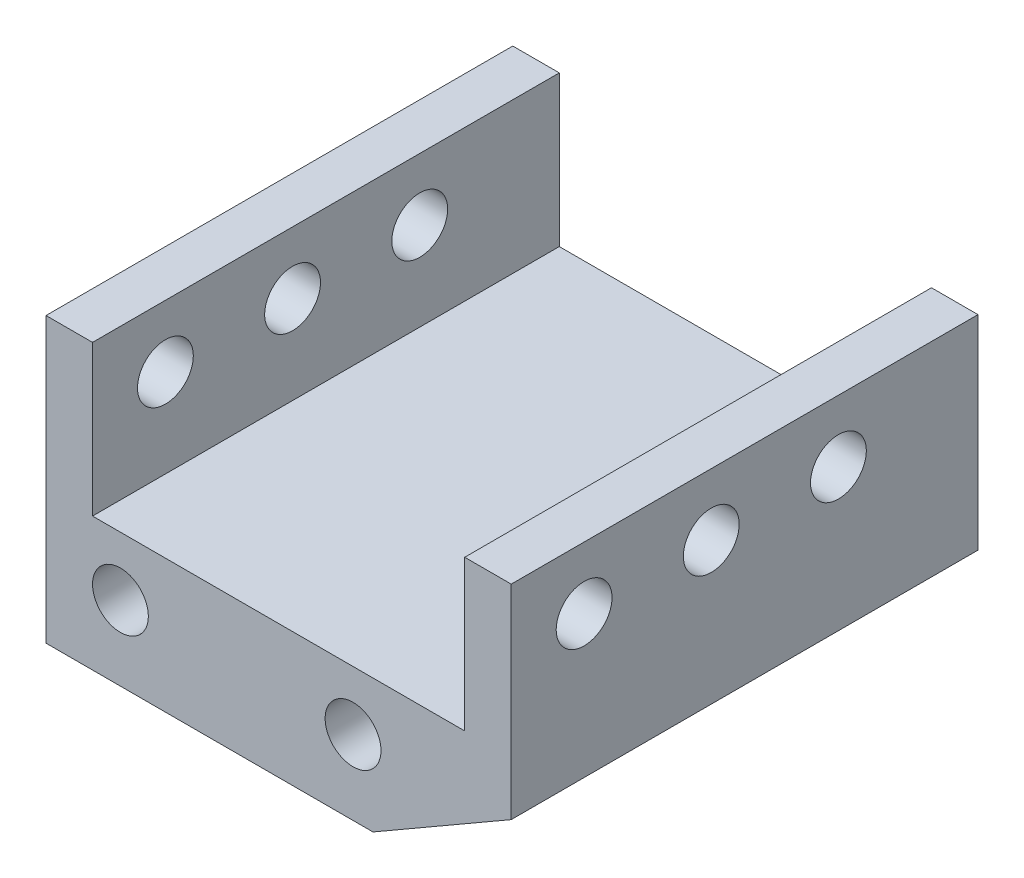
ISO-10303-21;
HEADER;
FILE_DESCRIPTION(('STEP AP214'),'2;1');
FILE_NAME('part.step','',(''),(''),'','','');
FILE_SCHEMA(('AUTOMOTIVE_DESIGN { 1 0 10303 214 1 1 1 1 }'));
ENDSEC;
DATA;
#1=APPLICATION_CONTEXT('core data for automotive mechanical design processes');
#2=APPLICATION_PROTOCOL_DEFINITION('international standard','automotive_design',2000,#1);
#3=PRODUCT_CONTEXT('',#1,'mechanical');
#4=PRODUCT('Part','Part','',(#3));
#5=PRODUCT_RELATED_PRODUCT_CATEGORY('part','',(#4));
#6=PRODUCT_DEFINITION_FORMATION('','',#4);
#7=PRODUCT_DEFINITION_CONTEXT('part definition',#1,'design');
#8=PRODUCT_DEFINITION('design','',#6,#7);
#9=PRODUCT_DEFINITION_SHAPE('','',#8);
#10=(LENGTH_UNIT() NAMED_UNIT(*) SI_UNIT(.MILLI.,.METRE.));
#11=(NAMED_UNIT(*) PLANE_ANGLE_UNIT() SI_UNIT($,.RADIAN.));
#12=(NAMED_UNIT(*) SI_UNIT($,.STERADIAN.) SOLID_ANGLE_UNIT());
#13=UNCERTAINTY_MEASURE_WITH_UNIT(LENGTH_MEASURE(1.E-05),#10,'distance_accuracy_value','');
#14=(GEOMETRIC_REPRESENTATION_CONTEXT(3) GLOBAL_UNCERTAINTY_ASSIGNED_CONTEXT((#13)) GLOBAL_UNIT_ASSIGNED_CONTEXT((#10,
#11,#12)) REPRESENTATION_CONTEXT('',''));
#15=CARTESIAN_POINT('',(0.,0.,0.));
#16=DIRECTION('',(0.,0.,1.));
#17=DIRECTION('',(1.,0.,0.));
#18=AXIS2_PLACEMENT_3D('',#15,#16,#17);
#19=CARTESIAN_POINT('',(-27.,8.69999999999999,-60.9410016931789));
#20=DIRECTION('',(-1.,0.,0.));
#21=DIRECTION('',(0.,-1.,0.));
#22=AXIS2_PLACEMENT_3D('',#19,#20,#21);
#23=PLANE('',#22);
#24=CARTESIAN_POINT('',(-27.,4.69999999999999,-21.1));
#25=DIRECTION('',(-1.,0.,0.));
#26=DIRECTION('',(0.,-1.,0.));
#27=AXIS2_PLACEMENT_3D('',#24,#25,#26);
#28=CIRCLE('',#27,1.8);
#29=CARTESIAN_POINT('',(-27.,2.89999999999999,-21.1));
#30=VERTEX_POINT('',#29);
#31=EDGE_CURVE('E154',#30,#30,#28,.T.);
#32=ORIENTED_EDGE('',*,*,#31,.F.);
#33=EDGE_LOOP('',(#32));
#34=FACE_BOUND('',#33,.T.);
#35=CARTESIAN_POINT('',(-27.,4.69999999999999,-12.9));
#36=DIRECTION('',(-1.,0.,0.));
#37=DIRECTION('',(0.,-1.,0.));
#38=AXIS2_PLACEMENT_3D('',#35,#36,#37);
#39=CIRCLE('',#38,1.8);
#40=CARTESIAN_POINT('',(-27.,2.9,-12.9));
#41=VERTEX_POINT('',#40);
#42=EDGE_CURVE('E158',#41,#41,#39,.T.);
#43=ORIENTED_EDGE('',*,*,#42,.F.);
#44=EDGE_LOOP('',(#43));
#45=FACE_BOUND('',#44,.T.);
#46=CARTESIAN_POINT('',(-27.,4.7,-4.70000000000001));
#47=DIRECTION('',(-1.,0.,0.));
#48=DIRECTION('',(0.,-1.,0.));
#49=AXIS2_PLACEMENT_3D('',#46,#47,#48);
#50=CIRCLE('',#49,1.79999999999992);
#51=CARTESIAN_POINT('',(-27.,2.90000000000008,-4.70000000000001));
#52=VERTEX_POINT('',#51);
#53=EDGE_CURVE('E153',#52,#52,#50,.T.);
#54=ORIENTED_EDGE('',*,*,#53,.F.);
#55=EDGE_LOOP('',(#54));
#56=FACE_BOUND('',#55,.T.);
#57=DIRECTION('',(0.,0.,1.));
#58=VECTOR('',#57,1.);
#59=CARTESIAN_POINT('',(-27.,8.69999999999999,-60.9410016931789));
#60=LINE('',#59,#58);
#61=CARTESIAN_POINT('',(-27.,8.7,-30.1));
#62=VERTEX_POINT('',#61);
#63=CARTESIAN_POINT('',(-27.,8.69999999999999,0.));
#64=VERTEX_POINT('',#63);
#65=EDGE_CURVE('E107',#62,#64,#60,.T.);
#66=ORIENTED_EDGE('',*,*,#65,.F.);
#67=DIRECTION('',(0.,1.,0.));
#68=VECTOR('',#67,1.);
#69=CARTESIAN_POINT('',(-27.,-9.6,-30.1));
#70=LINE('',#69,#68);
#71=CARTESIAN_POINT('',(-27.,-9.6,-30.1));
#72=VERTEX_POINT('',#71);
#73=EDGE_CURVE('E110',#72,#62,#70,.T.);
#74=ORIENTED_EDGE('',*,*,#73,.F.);
#75=DIRECTION('',(0.,0.,1.));
#76=VECTOR('',#75,1.);
#77=CARTESIAN_POINT('',(-27.,-9.6,-60.9410016931789));
#78=LINE('',#77,#76);
#79=CARTESIAN_POINT('',(-27.,-9.6,0.));
#80=VERTEX_POINT('',#79);
#81=EDGE_CURVE('E115',#72,#80,#78,.T.);
#82=ORIENTED_EDGE('',*,*,#81,.T.);
#83=DIRECTION('',(0.,-1.,0.));
#84=VECTOR('',#83,1.);
#85=CARTESIAN_POINT('',(-27.,8.69999999999999,0.));
#86=LINE('',#85,#84);
#87=EDGE_CURVE('E112',#64,#80,#86,.T.);
#88=ORIENTED_EDGE('',*,*,#87,.F.);
#89=EDGE_LOOP('',(#66,#74,#82,#88));
#90=FACE_BOUND('',#89,.T.);
#91=ADVANCED_FACE('F35',(#34,#45,#56,#90),#23,.T.);
#92=CARTESIAN_POINT('',(-27.,-9.6,-60.9410016931789));
#93=DIRECTION('',(0.,-1.,0.));
#94=DIRECTION('',(0.,0.,-1.));
#95=AXIS2_PLACEMENT_3D('',#92,#93,#94);
#96=PLANE('',#95);
#97=ORIENTED_EDGE('',*,*,#81,.F.);
#98=DIRECTION('',(-1.,0.,0.));
#99=VECTOR('',#98,1.);
#100=CARTESIAN_POINT('',(-5.91384387633061,-9.6,-30.1));
#101=LINE('',#100,#99);
#102=CARTESIAN_POINT('',(-5.91384387633061,-9.6,-30.1));
#103=VERTEX_POINT('',#102);
#104=EDGE_CURVE('E129',#103,#72,#101,.T.);
#105=ORIENTED_EDGE('',*,*,#104,.F.);
#106=DIRECTION('',(0.,0.,1.));
#107=VECTOR('',#106,1.);
#108=CARTESIAN_POINT('',(-5.91384387633061,-9.6,-60.9410016931789));
#109=LINE('',#108,#107);
#110=CARTESIAN_POINT('',(-5.91384387633061,-9.6,0.));
#111=VERTEX_POINT('',#110);
#112=EDGE_CURVE('E219',#103,#111,#109,.T.);
#113=ORIENTED_EDGE('',*,*,#112,.T.);
#114=DIRECTION('',(1.,0.,0.));
#115=VECTOR('',#114,1.);
#116=CARTESIAN_POINT('',(-27.,-9.6,0.));
#117=LINE('',#116,#115);
#118=EDGE_CURVE('E191',#80,#111,#117,.T.);
#119=ORIENTED_EDGE('',*,*,#118,.F.);
#120=EDGE_LOOP('',(#97,#105,#113,#119));
#121=FACE_BOUND('',#120,.T.);
#122=ADVANCED_FACE('F255',(#121),#96,.T.);
#123=CARTESIAN_POINT('',(3.,-4.45358983848621,-60.9410016931789));
#124=DIRECTION('',(0.500000000000001,-0.866025403784438,0.));
#125=DIRECTION('',(0.866025403784438,0.500000000000001,0.));
#126=AXIS2_PLACEMENT_3D('',#123,#124,#125);
#127=PLANE('',#126);
#128=ORIENTED_EDGE('',*,*,#112,.F.);
#129=DIRECTION('',(-0.866025403784438,-0.500000000000001,0.));
#130=VECTOR('',#129,1.);
#131=CARTESIAN_POINT('',(3.,-4.45358983848621,-30.1));
#132=LINE('',#131,#130);
#133=CARTESIAN_POINT('',(3.,-4.45358983848621,-30.1));
#134=VERTEX_POINT('',#133);
#135=EDGE_CURVE('E150',#134,#103,#132,.T.);
#136=ORIENTED_EDGE('',*,*,#135,.F.);
#137=DIRECTION('',(0.,0.,1.));
#138=VECTOR('',#137,1.);
#139=CARTESIAN_POINT('',(3.,-4.45358983848621,-60.9410016931789));
#140=LINE('',#139,#138);
#141=CARTESIAN_POINT('',(3.,-4.45358983848621,0.));
#142=VERTEX_POINT('',#141);
#143=EDGE_CURVE('E217',#134,#142,#140,.T.);
#144=ORIENTED_EDGE('',*,*,#143,.T.);
#145=DIRECTION('',(0.866025403784438,0.500000000000001,0.));
#146=VECTOR('',#145,1.);
#147=CARTESIAN_POINT('',(3.,-4.45358983848621,0.));
#148=LINE('',#147,#146);
#149=EDGE_CURVE('E194',#111,#142,#148,.T.);
#150=ORIENTED_EDGE('',*,*,#149,.F.);
#151=EDGE_LOOP('',(#128,#136,#144,#150));
#152=FACE_BOUND('',#151,.T.);
#153=ADVANCED_FACE('F251',(#152),#127,.T.);
#154=CARTESIAN_POINT('',(3.,8.7,-60.9410016931789));
#155=DIRECTION('',(1.,0.,0.));
#156=DIRECTION('',(0.,1.,0.));
#157=AXIS2_PLACEMENT_3D('',#154,#155,#156);
#158=PLANE('',#157);
#159=CARTESIAN_POINT('',(3.,4.69999999999999,-21.1));
#160=DIRECTION('',(1.,0.,0.));
#161=DIRECTION('',(0.,1.,0.));
#162=AXIS2_PLACEMENT_3D('',#159,#160,#161);
#163=CIRCLE('',#162,1.8);
#164=CARTESIAN_POINT('',(3.,6.49999999999999,-21.1));
#165=VERTEX_POINT('',#164);
#166=EDGE_CURVE('E179',#165,#165,#163,.T.);
#167=ORIENTED_EDGE('',*,*,#166,.F.);
#168=EDGE_LOOP('',(#167));
#169=FACE_BOUND('',#168,.T.);
#170=CARTESIAN_POINT('',(3.,4.69999999999999,-12.9));
#171=DIRECTION('',(1.,0.,0.));
#172=DIRECTION('',(0.,1.,0.));
#173=AXIS2_PLACEMENT_3D('',#170,#171,#172);
#174=CIRCLE('',#173,1.8);
#175=CARTESIAN_POINT('',(3.,6.49999999999998,-12.9));
#176=VERTEX_POINT('',#175);
#177=EDGE_CURVE('E173',#176,#176,#174,.T.);
#178=ORIENTED_EDGE('',*,*,#177,.F.);
#179=EDGE_LOOP('',(#178));
#180=FACE_BOUND('',#179,.T.);
#181=CARTESIAN_POINT('',(3.,4.69999999999999,-4.70000000000001));
#182=DIRECTION('',(1.,0.,0.));
#183=DIRECTION('',(0.,1.,0.));
#184=AXIS2_PLACEMENT_3D('',#181,#182,#183);
#185=CIRCLE('',#184,1.79999999999992);
#186=CARTESIAN_POINT('',(3.,6.49999999999991,-4.70000000000001));
#187=VERTEX_POINT('',#186);
#188=EDGE_CURVE('E166',#187,#187,#185,.T.);
#189=ORIENTED_EDGE('',*,*,#188,.F.);
#190=EDGE_LOOP('',(#189));
#191=FACE_BOUND('',#190,.T.);
#192=ORIENTED_EDGE('',*,*,#143,.F.);
#193=DIRECTION('',(0.,-1.,0.));
#194=VECTOR('',#193,1.);
#195=CARTESIAN_POINT('',(3.,8.7,-30.1));
#196=LINE('',#195,#194);
#197=CARTESIAN_POINT('',(3.,8.7,-30.1));
#198=VERTEX_POINT('',#197);
#199=EDGE_CURVE('E147',#198,#134,#196,.T.);
#200=ORIENTED_EDGE('',*,*,#199,.F.);
#201=DIRECTION('',(0.,0.,1.));
#202=VECTOR('',#201,1.);
#203=CARTESIAN_POINT('',(3.,8.7,-60.9410016931789));
#204=LINE('',#203,#202);
#205=CARTESIAN_POINT('',(3.,8.7,0.));
#206=VERTEX_POINT('',#205);
#207=EDGE_CURVE('E215',#198,#206,#204,.T.);
#208=ORIENTED_EDGE('',*,*,#207,.T.);
#209=DIRECTION('',(0.,1.,0.));
#210=VECTOR('',#209,1.);
#211=CARTESIAN_POINT('',(3.,8.7,0.));
#212=LINE('',#211,#210);
#213=EDGE_CURVE('E197',#142,#206,#212,.T.);
#214=ORIENTED_EDGE('',*,*,#213,.F.);
#215=EDGE_LOOP('',(#192,#200,#208,#214));
#216=FACE_BOUND('',#215,.T.);
#217=ADVANCED_FACE('F248',(#169,#180,#191,#216),#158,.T.);
#218=CARTESIAN_POINT('',(3.,8.7,-60.9410016931789));
#219=DIRECTION('',(0.,1.,0.));
#220=DIRECTION('',(0.,0.,1.));
#221=AXIS2_PLACEMENT_3D('',#218,#219,#220);
#222=PLANE('',#221);
#223=ORIENTED_EDGE('',*,*,#207,.F.);
#224=DIRECTION('',(1.,0.,0.));
#225=VECTOR('',#224,1.);
#226=CARTESIAN_POINT('',(0.,8.7,-30.1));
#227=LINE('',#226,#225);
#228=CARTESIAN_POINT('',(0.,8.7,-30.1));
#229=VERTEX_POINT('',#228);
#230=EDGE_CURVE('E144',#229,#198,#227,.T.);
#231=ORIENTED_EDGE('',*,*,#230,.F.);
#232=DIRECTION('',(0.,0.,1.));
#233=VECTOR('',#232,1.);
#234=CARTESIAN_POINT('',(0.,8.7,-60.9410016931789));
#235=LINE('',#234,#233);
#236=CARTESIAN_POINT('',(0.,8.7,0.));
#237=VERTEX_POINT('',#236);
#238=EDGE_CURVE('E213',#229,#237,#235,.T.);
#239=ORIENTED_EDGE('',*,*,#238,.T.);
#240=DIRECTION('',(-1.,0.,0.));
#241=VECTOR('',#240,1.);
#242=CARTESIAN_POINT('',(3.,8.7,0.));
#243=LINE('',#242,#241);
#244=EDGE_CURVE('E200',#206,#237,#243,.T.);
#245=ORIENTED_EDGE('',*,*,#244,.F.);
#246=EDGE_LOOP('',(#223,#231,#239,#245));
#247=FACE_BOUND('',#246,.T.);
#248=ADVANCED_FACE('F244',(#247),#222,.T.);
#249=CARTESIAN_POINT('',(0.,8.7,-60.9410016931789));
#250=DIRECTION('',(-1.,0.,0.));
#251=DIRECTION('',(0.,-1.,0.));
#252=AXIS2_PLACEMENT_3D('',#249,#250,#251);
#253=PLANE('',#252);
#254=ORIENTED_EDGE('',*,*,#238,.F.);
#255=DIRECTION('',(0.,1.,0.));
#256=VECTOR('',#255,1.);
#257=CARTESIAN_POINT('',(0.,-0.999999999999998,-30.1));
#258=LINE('',#257,#256);
#259=CARTESIAN_POINT('',(0.,-0.999999999999998,-30.1));
#260=VERTEX_POINT('',#259);
#261=EDGE_CURVE('E141',#260,#229,#258,.T.);
#262=ORIENTED_EDGE('',*,*,#261,.F.);
#263=DIRECTION('',(0.,0.,1.));
#264=VECTOR('',#263,1.);
#265=CARTESIAN_POINT('',(0.,-0.999999999999999,-60.9410016931789));
#266=LINE('',#265,#264);
#267=CARTESIAN_POINT('',(0.,-0.999999999999999,0.));
#268=VERTEX_POINT('',#267);
#269=EDGE_CURVE('E210',#260,#268,#266,.T.);
#270=ORIENTED_EDGE('',*,*,#269,.T.);
#271=DIRECTION('',(0.,-1.,0.));
#272=VECTOR('',#271,1.);
#273=CARTESIAN_POINT('',(0.,8.7,0.));
#274=LINE('',#273,#272);
#275=EDGE_CURVE('E203',#237,#268,#274,.T.);
#276=ORIENTED_EDGE('',*,*,#275,.F.);
#277=EDGE_LOOP('',(#254,#262,#270,#276));
#278=FACE_BOUND('',#277,.T.);
#279=CARTESIAN_POINT('',(0.,4.69999999999999,-21.1));
#280=DIRECTION('',(-1.,0.,0.));
#281=DIRECTION('',(0.,-1.,0.));
#282=AXIS2_PLACEMENT_3D('',#279,#280,#281);
#283=CIRCLE('',#282,1.8);
#284=CARTESIAN_POINT('',(0.,2.89999999999999,-21.1));
#285=VERTEX_POINT('',#284);
#286=EDGE_CURVE('E176',#285,#285,#283,.T.);
#287=ORIENTED_EDGE('',*,*,#286,.F.);
#288=EDGE_LOOP('',(#287));
#289=FACE_BOUND('',#288,.T.);
#290=CARTESIAN_POINT('',(0.,4.69999999999999,-12.9));
#291=DIRECTION('',(-1.,0.,0.));
#292=DIRECTION('',(0.,-1.,0.));
#293=AXIS2_PLACEMENT_3D('',#290,#291,#292);
#294=CIRCLE('',#293,1.8);
#295=CARTESIAN_POINT('',(0.,2.89999999999999,-12.9));
#296=VERTEX_POINT('',#295);
#297=EDGE_CURVE('E170',#296,#296,#294,.T.);
#298=ORIENTED_EDGE('',*,*,#297,.F.);
#299=EDGE_LOOP('',(#298));
#300=FACE_BOUND('',#299,.T.);
#301=CARTESIAN_POINT('',(0.,4.69999999999999,-4.70000000000001));
#302=DIRECTION('',(-1.,0.,0.));
#303=DIRECTION('',(0.,-1.,0.));
#304=AXIS2_PLACEMENT_3D('',#301,#302,#303);
#305=CIRCLE('',#304,1.79999999999992);
#306=CARTESIAN_POINT('',(0.,2.90000000000008,-4.70000000000001));
#307=VERTEX_POINT('',#306);
#308=EDGE_CURVE('E163',#307,#307,#305,.T.);
#309=ORIENTED_EDGE('',*,*,#308,.F.);
#310=EDGE_LOOP('',(#309));
#311=FACE_BOUND('',#310,.T.);
#312=ADVANCED_FACE('F239',(#278,#289,#300,#311),#253,.T.);
#313=CARTESIAN_POINT('',(0.,-0.999999999999999,-60.9410016931789));
#314=DIRECTION('',(0.,1.,0.));
#315=DIRECTION('',(-1.,0.,0.));
#316=AXIS2_PLACEMENT_3D('',#313,#314,#315);
#317=PLANE('',#316);
#318=ORIENTED_EDGE('',*,*,#269,.F.);
#319=DIRECTION('',(1.,0.,0.));
#320=VECTOR('',#319,1.);
#321=CARTESIAN_POINT('',(-24.,-1.,-30.1));
#322=LINE('',#321,#320);
#323=CARTESIAN_POINT('',(-24.,-1.,-30.1));
#324=VERTEX_POINT('',#323);
#325=EDGE_CURVE('E138',#324,#260,#322,.T.);
#326=ORIENTED_EDGE('',*,*,#325,.F.);
#327=DIRECTION('',(0.,0.,1.));
#328=VECTOR('',#327,1.);
#329=CARTESIAN_POINT('',(-24.,-1.,-60.9410016931789));
#330=LINE('',#329,#328);
#331=CARTESIAN_POINT('',(-24.,-1.,0.));
#332=VERTEX_POINT('',#331);
#333=EDGE_CURVE('E44',#324,#332,#330,.T.);
#334=ORIENTED_EDGE('',*,*,#333,.T.);
#335=DIRECTION('',(-1.,0.,0.));
#336=VECTOR('',#335,1.);
#337=CARTESIAN_POINT('',(0.,-0.999999999999999,0.));
#338=LINE('',#337,#336);
#339=EDGE_CURVE('E205',#268,#332,#338,.T.);
#340=ORIENTED_EDGE('',*,*,#339,.F.);
#341=EDGE_LOOP('',(#318,#326,#334,#340));
#342=FACE_BOUND('',#341,.T.);
#343=ADVANCED_FACE('F232',(#342),#317,.T.);
#344=CARTESIAN_POINT('',(-24.,-1.,-60.9410016931789));
#345=DIRECTION('',(1.,0.,0.));
#346=DIRECTION('',(0.,0.,-1.));
#347=AXIS2_PLACEMENT_3D('',#344,#345,#346);
#348=PLANE('',#347);
#349=CARTESIAN_POINT('',(-24.,4.69999999999999,-21.1));
#350=DIRECTION('',(1.,0.,0.));
#351=DIRECTION('',(0.,0.,-1.));
#352=AXIS2_PLACEMENT_3D('',#349,#350,#351);
#353=CIRCLE('',#352,1.8);
#354=CARTESIAN_POINT('',(-24.,4.69999999999999,-22.9));
#355=VERTEX_POINT('',#354);
#356=EDGE_CURVE('E39',#355,#355,#353,.T.);
#357=ORIENTED_EDGE('',*,*,#356,.F.);
#358=EDGE_LOOP('',(#357));
#359=FACE_BOUND('',#358,.T.);
#360=CARTESIAN_POINT('',(-24.,4.69999999999999,-12.9));
#361=DIRECTION('',(1.,0.,0.));
#362=DIRECTION('',(0.,0.,-1.));
#363=AXIS2_PLACEMENT_3D('',#360,#361,#362);
#364=CIRCLE('',#363,1.8);
#365=CARTESIAN_POINT('',(-24.,4.69999999999999,-14.7));
#366=VERTEX_POINT('',#365);
#367=EDGE_CURVE('E169',#366,#366,#364,.T.);
#368=ORIENTED_EDGE('',*,*,#367,.F.);
#369=EDGE_LOOP('',(#368));
#370=FACE_BOUND('',#369,.T.);
#371=CARTESIAN_POINT('',(-24.,4.7,-4.70000000000001));
#372=DIRECTION('',(1.,0.,0.));
#373=DIRECTION('',(0.,0.,-1.));
#374=AXIS2_PLACEMENT_3D('',#371,#372,#373);
#375=CIRCLE('',#374,1.79999999999992);
#376=CARTESIAN_POINT('',(-24.,4.7,-6.49999999999993));
#377=VERTEX_POINT('',#376);
#378=EDGE_CURVE('E157',#377,#377,#375,.T.);
#379=ORIENTED_EDGE('',*,*,#378,.F.);
#380=EDGE_LOOP('',(#379));
#381=FACE_BOUND('',#380,.T.);
#382=ORIENTED_EDGE('',*,*,#333,.F.);
#383=DIRECTION('',(0.,-1.,0.));
#384=VECTOR('',#383,1.);
#385=CARTESIAN_POINT('',(-24.,8.69999999999999,-30.1));
#386=LINE('',#385,#384);
#387=CARTESIAN_POINT('',(-24.,8.69999999999999,-30.1));
#388=VERTEX_POINT('',#387);
#389=EDGE_CURVE('E122',#388,#324,#386,.T.);
#390=ORIENTED_EDGE('',*,*,#389,.F.);
#391=DIRECTION('',(0.,0.,1.));
#392=VECTOR('',#391,1.);
#393=CARTESIAN_POINT('',(-24.,8.69999999999999,-60.9410016931789));
#394=LINE('',#393,#392);
#395=CARTESIAN_POINT('',(-24.,8.69999999999999,0.));
#396=VERTEX_POINT('',#395);
#397=EDGE_CURVE('E11',#388,#396,#394,.T.);
#398=ORIENTED_EDGE('',*,*,#397,.T.);
#399=DIRECTION('',(0.,1.,0.));
#400=VECTOR('',#399,1.);
#401=CARTESIAN_POINT('',(-24.,-1.,0.));
#402=LINE('',#401,#400);
#403=EDGE_CURVE('E116',#332,#396,#402,.T.);
#404=ORIENTED_EDGE('',*,*,#403,.F.);
#405=EDGE_LOOP('',(#382,#390,#398,#404));
#406=FACE_BOUND('',#405,.T.);
#407=ADVANCED_FACE('F229',(#359,#370,#381,#406),#348,.T.);
#408=CARTESIAN_POINT('',(-24.,8.69999999999999,-60.9410016931789));
#409=DIRECTION('',(0.,1.,0.));
#410=DIRECTION('',(-1.,0.,0.));
#411=AXIS2_PLACEMENT_3D('',#408,#409,#410);
#412=PLANE('',#411);
#413=ORIENTED_EDGE('',*,*,#397,.F.);
#414=DIRECTION('',(1.,0.,0.));
#415=VECTOR('',#414,1.);
#416=CARTESIAN_POINT('',(-27.,8.7,-30.1));
#417=LINE('',#416,#415);
#418=EDGE_CURVE('E119',#62,#388,#417,.T.);
#419=ORIENTED_EDGE('',*,*,#418,.F.);
#420=ORIENTED_EDGE('',*,*,#65,.T.);
#421=DIRECTION('',(-1.,0.,0.));
#422=VECTOR('',#421,1.);
#423=CARTESIAN_POINT('',(-24.,8.69999999999999,0.));
#424=LINE('',#423,#422);
#425=EDGE_CURVE('E188',#396,#64,#424,.T.);
#426=ORIENTED_EDGE('',*,*,#425,.F.);
#427=EDGE_LOOP('',(#413,#419,#420,#426));
#428=FACE_BOUND('',#427,.T.);
#429=ADVANCED_FACE('F37',(#428),#412,.T.);
#430=CARTESIAN_POINT('',(-22.2,-4.8,-60.9410016931789));
#431=DIRECTION('',(0.,0.,1.));
#432=DIRECTION('',(1.,0.,0.));
#433=AXIS2_PLACEMENT_3D('',#430,#431,#432);
#434=CYLINDRICAL_SURFACE('',#433,1.8);
#435=CARTESIAN_POINT('',(-22.2,-4.8,0.));
#436=DIRECTION('',(0.,0.,1.));
#437=DIRECTION('',(1.,0.,0.));
#438=AXIS2_PLACEMENT_3D('',#435,#436,#437);
#439=CIRCLE('',#438,1.8);
#440=CARTESIAN_POINT('',(-20.4,-4.8,0.));
#441=VERTEX_POINT('',#440);
#442=EDGE_CURVE('E185',#441,#441,#439,.T.);
#443=ORIENTED_EDGE('',*,*,#442,.T.);
#444=EDGE_LOOP('',(#443));
#445=FACE_BOUND('',#444,.T.);
#446=CARTESIAN_POINT('',(-22.2,-4.8,-30.1));
#447=DIRECTION('',(0.,0.,-1.));
#448=DIRECTION('',(0.,1.,0.));
#449=AXIS2_PLACEMENT_3D('',#446,#447,#448);
#450=CIRCLE('',#449,1.8);
#451=CARTESIAN_POINT('',(-22.2,-3.,-30.1));
#452=VERTEX_POINT('',#451);
#453=EDGE_CURVE('E133',#452,#452,#450,.T.);
#454=ORIENTED_EDGE('',*,*,#453,.T.);
#455=EDGE_LOOP('',(#454));
#456=FACE_BOUND('',#455,.T.);
#457=ADVANCED_FACE('F260',(#445,#456),#434,.F.);
#458=CARTESIAN_POINT('',(0.,0.,0.));
#459=DIRECTION('',(0.,0.,1.));
#460=DIRECTION('',(1.,0.,0.));
#461=AXIS2_PLACEMENT_3D('',#458,#459,#460);
#462=PLANE('',#461);
#463=CARTESIAN_POINT('',(-7.2,-4.8,0.));
#464=DIRECTION('',(0.,0.,1.));
#465=DIRECTION('',(1.,0.,0.));
#466=AXIS2_PLACEMENT_3D('',#463,#464,#465);
#467=CIRCLE('',#466,1.8);
#468=CARTESIAN_POINT('',(-5.4,-4.8,0.));
#469=VERTEX_POINT('',#468);
#470=EDGE_CURVE('E182',#469,#469,#467,.T.);
#471=ORIENTED_EDGE('',*,*,#470,.F.);
#472=EDGE_LOOP('',(#471));
#473=FACE_BOUND('',#472,.T.);
#474=ORIENTED_EDGE('',*,*,#442,.F.);
#475=EDGE_LOOP('',(#474));
#476=FACE_BOUND('',#475,.T.);
#477=ORIENTED_EDGE('',*,*,#425,.T.);
#478=ORIENTED_EDGE('',*,*,#87,.T.);
#479=ORIENTED_EDGE('',*,*,#118,.T.);
#480=ORIENTED_EDGE('',*,*,#149,.T.);
#481=ORIENTED_EDGE('',*,*,#213,.T.);
#482=ORIENTED_EDGE('',*,*,#244,.T.);
#483=ORIENTED_EDGE('',*,*,#275,.T.);
#484=ORIENTED_EDGE('',*,*,#339,.T.);
#485=ORIENTED_EDGE('',*,*,#403,.T.);
#486=EDGE_LOOP('',(#477,#478,#479,#480,#481,#482,#483,#484,#485));
#487=FACE_BOUND('',#486,.T.);
#488=ADVANCED_FACE('F257',(#473,#476,#487),#462,.T.);
#489=CARTESIAN_POINT('',(-7.2,-4.8,-60.9410016931789));
#490=DIRECTION('',(0.,0.,1.));
#491=DIRECTION('',(1.,0.,0.));
#492=AXIS2_PLACEMENT_3D('',#489,#490,#491);
#493=CYLINDRICAL_SURFACE('',#492,1.8);
#494=ORIENTED_EDGE('',*,*,#470,.T.);
#495=EDGE_LOOP('',(#494));
#496=FACE_BOUND('',#495,.T.);
#497=CARTESIAN_POINT('',(-7.2,-4.8,-30.1));
#498=DIRECTION('',(0.,0.,-1.));
#499=DIRECTION('',(0.,1.,0.));
#500=AXIS2_PLACEMENT_3D('',#497,#498,#499);
#501=CIRCLE('',#500,1.8);
#502=CARTESIAN_POINT('',(-7.2,-3.,-30.1));
#503=VERTEX_POINT('',#502);
#504=EDGE_CURVE('E130',#503,#503,#501,.T.);
#505=ORIENTED_EDGE('',*,*,#504,.T.);
#506=EDGE_LOOP('',(#505));
#507=FACE_BOUND('',#506,.T.);
#508=ADVANCED_FACE('F259',(#496,#507),#493,.F.);
#509=CARTESIAN_POINT('',(15.500025,4.69999999999999,-4.70000000000001));
#510=DIRECTION('',(-1.,0.,0.));
#511=DIRECTION('',(0.,-1.,0.));
#512=AXIS2_PLACEMENT_3D('',#509,#510,#511);
#513=CYLINDRICAL_SURFACE('',#512,1.79999999999992);
#514=ORIENTED_EDGE('',*,*,#378,.T.);
#515=EDGE_LOOP('',(#514));
#516=FACE_BOUND('',#515,.T.);
#517=ORIENTED_EDGE('',*,*,#53,.T.);
#518=EDGE_LOOP('',(#517));
#519=FACE_BOUND('',#518,.T.);
#520=ADVANCED_FACE('F267',(#516,#519),#513,.F.);
#521=CARTESIAN_POINT('',(15.500025,4.69999999999998,-12.9));
#522=DIRECTION('',(-1.,0.,0.));
#523=DIRECTION('',(0.,-1.,0.));
#524=AXIS2_PLACEMENT_3D('',#521,#522,#523);
#525=CYLINDRICAL_SURFACE('',#524,1.8);
#526=ORIENTED_EDGE('',*,*,#367,.T.);
#527=EDGE_LOOP('',(#526));
#528=FACE_BOUND('',#527,.T.);
#529=ORIENTED_EDGE('',*,*,#42,.T.);
#530=EDGE_LOOP('',(#529));
#531=FACE_BOUND('',#530,.T.);
#532=ADVANCED_FACE('F226',(#528,#531),#525,.F.);
#533=CARTESIAN_POINT('',(15.500025,4.69999999999998,-21.1));
#534=DIRECTION('',(-1.,0.,0.));
#535=DIRECTION('',(0.,-1.,0.));
#536=AXIS2_PLACEMENT_3D('',#533,#534,#535);
#537=CYLINDRICAL_SURFACE('',#536,1.8);
#538=ORIENTED_EDGE('',*,*,#356,.T.);
#539=EDGE_LOOP('',(#538));
#540=FACE_BOUND('',#539,.T.);
#541=ORIENTED_EDGE('',*,*,#31,.T.);
#542=EDGE_LOOP('',(#541));
#543=FACE_BOUND('',#542,.T.);
#544=ADVANCED_FACE('F340',(#540,#543),#537,.F.);
#545=ORIENTED_EDGE('',*,*,#188,.T.);
#546=EDGE_LOOP('',(#545));
#547=FACE_BOUND('',#546,.T.);
#548=ORIENTED_EDGE('',*,*,#308,.T.);
#549=EDGE_LOOP('',(#548));
#550=FACE_BOUND('',#549,.T.);
#551=ADVANCED_FACE('F348',(#547,#550),#513,.F.);
#552=ORIENTED_EDGE('',*,*,#177,.T.);
#553=EDGE_LOOP('',(#552));
#554=FACE_BOUND('',#553,.T.);
#555=ORIENTED_EDGE('',*,*,#297,.T.);
#556=EDGE_LOOP('',(#555));
#557=FACE_BOUND('',#556,.T.);
#558=ADVANCED_FACE('F337',(#554,#557),#525,.F.);
#559=ORIENTED_EDGE('',*,*,#166,.T.);
#560=EDGE_LOOP('',(#559));
#561=FACE_BOUND('',#560,.T.);
#562=ORIENTED_EDGE('',*,*,#286,.T.);
#563=EDGE_LOOP('',(#562));
#564=FACE_BOUND('',#563,.T.);
#565=ADVANCED_FACE('F327',(#561,#564),#537,.F.);
#566=CARTESIAN_POINT('',(0.,0.,-30.1));
#567=DIRECTION('',(0.,0.,-1.));
#568=DIRECTION('',(0.,1.,0.));
#569=AXIS2_PLACEMENT_3D('',#566,#567,#568);
#570=PLANE('',#569);
#571=ORIENTED_EDGE('',*,*,#504,.F.);
#572=EDGE_LOOP('',(#571));
#573=FACE_BOUND('',#572,.T.);
#574=ORIENTED_EDGE('',*,*,#73,.T.);
#575=ORIENTED_EDGE('',*,*,#418,.T.);
#576=ORIENTED_EDGE('',*,*,#389,.T.);
#577=ORIENTED_EDGE('',*,*,#325,.T.);
#578=ORIENTED_EDGE('',*,*,#261,.T.);
#579=ORIENTED_EDGE('',*,*,#230,.T.);
#580=ORIENTED_EDGE('',*,*,#199,.T.);
#581=ORIENTED_EDGE('',*,*,#135,.T.);
#582=ORIENTED_EDGE('',*,*,#104,.T.);
#583=EDGE_LOOP('',(#574,#575,#576,#577,#578,#579,#580,#581,#582));
#584=FACE_BOUND('',#583,.T.);
#585=ORIENTED_EDGE('',*,*,#453,.F.);
#586=EDGE_LOOP('',(#585));
#587=FACE_BOUND('',#586,.T.);
#588=ADVANCED_FACE('F125',(#573,#584,#587),#570,.T.);
#589=CLOSED_SHELL('',(#91,#122,#153,#217,#248,#312,#343,#407,#429,#457,#488,#508,#520,#532,#544,
#551,#558,#565,#588));
#590=MANIFOLD_SOLID_BREP('B2',#589);
#591=ADVANCED_BREP_SHAPE_REPRESENTATION('',(#18,#590),#14);
#592=SHAPE_DEFINITION_REPRESENTATION(#9,#591);
ENDSEC;
END-ISO-10303-21;
